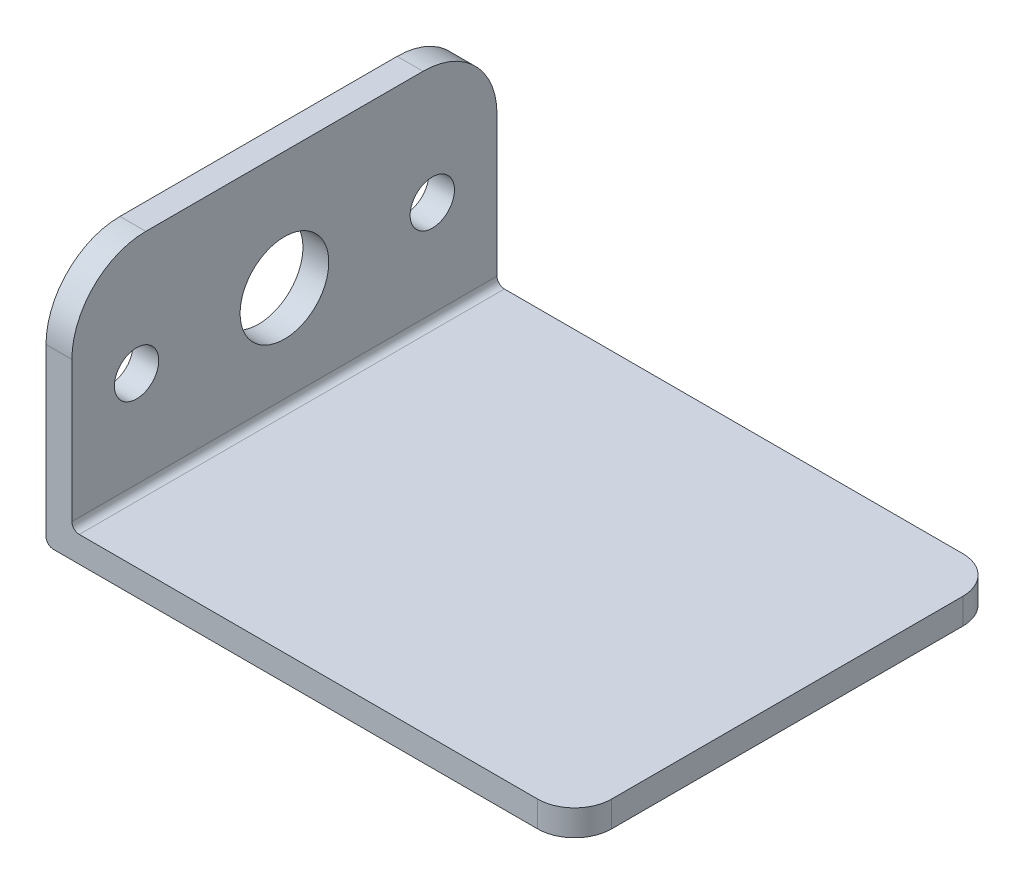
ISO-10303-21;
HEADER;
FILE_DESCRIPTION(('STEP AP214'),'2;1');
FILE_NAME('part.step','',(''),(''),'','','');
FILE_SCHEMA(('AUTOMOTIVE_DESIGN { 1 0 10303 214 1 1 1 1 }'));
ENDSEC;
DATA;
#1=APPLICATION_CONTEXT('core data for automotive mechanical design processes');
#2=APPLICATION_PROTOCOL_DEFINITION('international standard','automotive_design',2000,#1);
#3=PRODUCT_CONTEXT('',#1,'mechanical');
#4=PRODUCT('Part','Part','',(#3));
#5=PRODUCT_RELATED_PRODUCT_CATEGORY('part','',(#4));
#6=PRODUCT_DEFINITION_FORMATION('','',#4);
#7=PRODUCT_DEFINITION_CONTEXT('part definition',#1,'design');
#8=PRODUCT_DEFINITION('design','',#6,#7);
#9=PRODUCT_DEFINITION_SHAPE('','',#8);
#10=(LENGTH_UNIT() NAMED_UNIT(*) SI_UNIT(.MILLI.,.METRE.));
#11=(NAMED_UNIT(*) PLANE_ANGLE_UNIT() SI_UNIT($,.RADIAN.));
#12=(NAMED_UNIT(*) SI_UNIT($,.STERADIAN.) SOLID_ANGLE_UNIT());
#13=UNCERTAINTY_MEASURE_WITH_UNIT(LENGTH_MEASURE(1.E-05),#10,'distance_accuracy_value','');
#14=(GEOMETRIC_REPRESENTATION_CONTEXT(3) GLOBAL_UNCERTAINTY_ASSIGNED_CONTEXT((#13)) GLOBAL_UNIT_ASSIGNED_CONTEXT((#10,
#11,#12)) REPRESENTATION_CONTEXT('',''));
#15=CARTESIAN_POINT('',(0.,0.,0.));
#16=DIRECTION('',(0.,0.,1.));
#17=DIRECTION('',(1.,0.,0.));
#18=AXIS2_PLACEMENT_3D('',#15,#16,#17);
#19=CARTESIAN_POINT('',(3.50000000000001,3.5,28.75));
#20=DIRECTION('',(-1.,0.,0.));
#21=DIRECTION('',(0.,-1.,0.));
#22=AXIS2_PLACEMENT_3D('',#19,#20,#21);
#23=PLANE('',#22);
#24=DIRECTION('',(0.,1.,0.));
#25=VECTOR('',#24,1.);
#26=CARTESIAN_POINT('',(3.50000000000001,3.5,28.75));
#27=LINE('',#26,#25);
#28=CARTESIAN_POINT('',(3.5,4.5,28.75));
#29=VERTEX_POINT('',#28);
#30=CARTESIAN_POINT('',(3.5,23.5,28.75));
#31=VERTEX_POINT('',#30);
#32=EDGE_CURVE('E219',#29,#31,#27,.T.);
#33=ORIENTED_EDGE('',*,*,#32,.F.);
#34=DIRECTION('',(0.,0.,-1.));
#35=VECTOR('',#34,1.);
#36=CARTESIAN_POINT('',(3.5,4.5,-28.75));
#37=LINE('',#36,#35);
#38=CARTESIAN_POINT('',(3.5,4.5,-28.75));
#39=VERTEX_POINT('',#38);
#40=EDGE_CURVE('E201',#29,#39,#37,.T.);
#41=ORIENTED_EDGE('',*,*,#40,.T.);
#42=DIRECTION('',(0.,1.,0.));
#43=VECTOR('',#42,1.);
#44=CARTESIAN_POINT('',(3.50000000000001,3.5,-28.75));
#45=LINE('',#44,#43);
#46=CARTESIAN_POINT('',(3.5,23.5,-28.75));
#47=VERTEX_POINT('',#46);
#48=EDGE_CURVE('E212',#39,#47,#45,.T.);
#49=ORIENTED_EDGE('',*,*,#48,.T.);
#50=CARTESIAN_POINT('',(3.5,23.5,-18.75));
#51=DIRECTION('',(-1.,0.,0.));
#52=DIRECTION('',(0.,-1.,0.));
#53=AXIS2_PLACEMENT_3D('',#50,#51,#52);
#54=CIRCLE('',#53,10.);
#55=CARTESIAN_POINT('',(3.5,33.5,-18.75));
#56=VERTEX_POINT('',#55);
#57=EDGE_CURVE('E187',#47,#56,#54,.F.);
#58=ORIENTED_EDGE('',*,*,#57,.T.);
#59=DIRECTION('',(0.,0.,-1.));
#60=VECTOR('',#59,1.);
#61=CARTESIAN_POINT('',(3.5,33.5,28.75));
#62=LINE('',#61,#60);
#63=CARTESIAN_POINT('',(3.5,33.5,18.75));
#64=VERTEX_POINT('',#63);
#65=EDGE_CURVE('E153',#64,#56,#62,.T.);
#66=ORIENTED_EDGE('',*,*,#65,.F.);
#67=CARTESIAN_POINT('',(3.5,23.5,18.75));
#68=DIRECTION('',(-1.,0.,0.));
#69=DIRECTION('',(0.,-1.,0.));
#70=AXIS2_PLACEMENT_3D('',#67,#68,#69);
#71=CIRCLE('',#70,10.);
#72=EDGE_CURVE('E184',#64,#31,#71,.F.);
#73=ORIENTED_EDGE('',*,*,#72,.T.);
#74=EDGE_LOOP('',(#33,#41,#49,#58,#66,#73));
#75=FACE_BOUND('',#74,.T.);
#76=CARTESIAN_POINT('',(3.5,17.5,-20.));
#77=DIRECTION('',(1.,0.,0.));
#78=DIRECTION('',(0.,1.,0.));
#79=AXIS2_PLACEMENT_3D('',#76,#77,#78);
#80=CIRCLE('',#79,3.);
#81=CARTESIAN_POINT('',(3.5,20.5,-20.));
#82=VERTEX_POINT('',#81);
#83=EDGE_CURVE('E266',#82,#82,#80,.T.);
#84=ORIENTED_EDGE('',*,*,#83,.F.);
#85=EDGE_LOOP('',(#84));
#86=FACE_BOUND('',#85,.T.);
#87=CARTESIAN_POINT('',(3.5,17.5,20.));
#88=DIRECTION('',(1.,0.,0.));
#89=DIRECTION('',(0.,1.,0.));
#90=AXIS2_PLACEMENT_3D('',#87,#88,#89);
#91=CIRCLE('',#90,3.);
#92=CARTESIAN_POINT('',(3.5,20.5,20.));
#93=VERTEX_POINT('',#92);
#94=EDGE_CURVE('E267',#93,#93,#91,.T.);
#95=ORIENTED_EDGE('',*,*,#94,.F.);
#96=EDGE_LOOP('',(#95));
#97=FACE_BOUND('',#96,.T.);
#98=CARTESIAN_POINT('',(3.5,17.5000000079424,8.25322719498123E-11));
#99=DIRECTION('',(-1.,0.,0.));
#100=DIRECTION('',(0.,-1.,0.));
#101=AXIS2_PLACEMENT_3D('',#98,#99,#100);
#102=CIRCLE('',#101,5.99999999229521);
#103=CARTESIAN_POINT('',(3.5,17.5000000079424,5.99999999237774));
#104=VERTEX_POINT('',#103);
#105=EDGE_CURVE('E270',#104,#104,#102,.F.);
#106=ORIENTED_EDGE('',*,*,#105,.F.);
#107=EDGE_LOOP('',(#106));
#108=FACE_BOUND('',#107,.T.);
#109=ADVANCED_FACE('F45',(#75,#86,#97,#108),#23,.F.);
#110=CARTESIAN_POINT('',(0.,33.5,28.75));
#111=DIRECTION('',(1.,0.,0.));
#112=DIRECTION('',(0.,1.,0.));
#113=AXIS2_PLACEMENT_3D('',#110,#111,#112);
#114=PLANE('',#113);
#115=DIRECTION('',(0.,-1.,0.));
#116=VECTOR('',#115,1.);
#117=CARTESIAN_POINT('',(0.,33.5,-28.75));
#118=LINE('',#117,#116);
#119=CARTESIAN_POINT('',(0.,23.5,-28.75));
#120=VERTEX_POINT('',#119);
#121=CARTESIAN_POINT('',(0.,1.,-28.75));
#122=VERTEX_POINT('',#121);
#123=EDGE_CURVE('E235',#120,#122,#118,.T.);
#124=ORIENTED_EDGE('',*,*,#123,.T.);
#125=DIRECTION('',(0.,0.,-1.));
#126=VECTOR('',#125,1.);
#127=CARTESIAN_POINT('',(0.,1.,28.75));
#128=LINE('',#127,#126);
#129=CARTESIAN_POINT('',(0.,1.,28.75));
#130=VERTEX_POINT('',#129);
#131=EDGE_CURVE('E197',#122,#130,#128,.F.);
#132=ORIENTED_EDGE('',*,*,#131,.T.);
#133=DIRECTION('',(0.,-1.,0.));
#134=VECTOR('',#133,1.);
#135=CARTESIAN_POINT('',(0.,33.5,28.75));
#136=LINE('',#135,#134);
#137=CARTESIAN_POINT('',(0.,23.5,28.75));
#138=VERTEX_POINT('',#137);
#139=EDGE_CURVE('E223',#138,#130,#136,.T.);
#140=ORIENTED_EDGE('',*,*,#139,.F.);
#141=CARTESIAN_POINT('',(0.,23.5,18.75));
#142=DIRECTION('',(1.,0.,0.));
#143=DIRECTION('',(0.,1.,0.));
#144=AXIS2_PLACEMENT_3D('',#141,#142,#143);
#145=CIRCLE('',#144,10.);
#146=CARTESIAN_POINT('',(0.,33.5,18.75));
#147=VERTEX_POINT('',#146);
#148=EDGE_CURVE('E177',#138,#147,#145,.F.);
#149=ORIENTED_EDGE('',*,*,#148,.T.);
#150=DIRECTION('',(0.,0.,-1.));
#151=VECTOR('',#150,1.);
#152=CARTESIAN_POINT('',(0.,33.5,28.75));
#153=LINE('',#152,#151);
#154=CARTESIAN_POINT('',(0.,33.5,-18.75));
#155=VERTEX_POINT('',#154);
#156=EDGE_CURVE('E226',#147,#155,#153,.T.);
#157=ORIENTED_EDGE('',*,*,#156,.T.);
#158=CARTESIAN_POINT('',(0.,23.5,-18.75));
#159=DIRECTION('',(1.,0.,0.));
#160=DIRECTION('',(0.,1.,0.));
#161=AXIS2_PLACEMENT_3D('',#158,#159,#160);
#162=CIRCLE('',#161,10.);
#163=EDGE_CURVE('E179',#155,#120,#162,.F.);
#164=ORIENTED_EDGE('',*,*,#163,.T.);
#165=EDGE_LOOP('',(#124,#132,#140,#149,#157,#164));
#166=FACE_BOUND('',#165,.T.);
#167=CARTESIAN_POINT('',(0.,17.5,-20.));
#168=DIRECTION('',(1.,0.,0.));
#169=DIRECTION('',(0.,1.,0.));
#170=AXIS2_PLACEMENT_3D('',#167,#168,#169);
#171=CIRCLE('',#170,3.);
#172=CARTESIAN_POINT('',(0.,20.5,-20.));
#173=VERTEX_POINT('',#172);
#174=EDGE_CURVE('E232',#173,#173,#171,.F.);
#175=ORIENTED_EDGE('',*,*,#174,.F.);
#176=EDGE_LOOP('',(#175));
#177=FACE_BOUND('',#176,.T.);
#178=CARTESIAN_POINT('',(0.,17.5,20.));
#179=DIRECTION('',(1.,0.,0.));
#180=DIRECTION('',(0.,1.,0.));
#181=AXIS2_PLACEMENT_3D('',#178,#179,#180);
#182=CIRCLE('',#181,3.);
#183=CARTESIAN_POINT('',(0.,20.5,20.));
#184=VERTEX_POINT('',#183);
#185=EDGE_CURVE('E263',#184,#184,#182,.F.);
#186=ORIENTED_EDGE('',*,*,#185,.F.);
#187=EDGE_LOOP('',(#186));
#188=FACE_BOUND('',#187,.T.);
#189=CARTESIAN_POINT('',(0.,17.5000000079424,8.24956113957545E-11));
#190=DIRECTION('',(1.,0.,0.));
#191=DIRECTION('',(0.,1.,0.));
#192=AXIS2_PLACEMENT_3D('',#189,#190,#191);
#193=CIRCLE('',#192,5.99999999229521);
#194=CARTESIAN_POINT('',(0.,17.5000000079424,5.9999999923777));
#195=VERTEX_POINT('',#194);
#196=EDGE_CURVE('E49',#195,#195,#193,.F.);
#197=ORIENTED_EDGE('',*,*,#196,.F.);
#198=EDGE_LOOP('',(#197));
#199=FACE_BOUND('',#198,.T.);
#200=ADVANCED_FACE('F252',(#166,#177,#188,#199),#114,.F.);
#201=CARTESIAN_POINT('',(0.,0.,28.75));
#202=DIRECTION('',(0.,1.,0.));
#203=DIRECTION('',(-1.,0.,0.));
#204=AXIS2_PLACEMENT_3D('',#201,#202,#203);
#205=PLANE('',#204);
#206=DIRECTION('',(1.,0.,0.));
#207=VECTOR('',#206,1.);
#208=CARTESIAN_POINT('',(0.,0.,28.75));
#209=LINE('',#208,#207);
#210=CARTESIAN_POINT('',(1.,0.,28.75));
#211=VERTEX_POINT('',#210);
#212=CARTESIAN_POINT('',(66.5,0.,28.75));
#213=VERTEX_POINT('',#212);
#214=EDGE_CURVE('E228',#211,#213,#209,.T.);
#215=ORIENTED_EDGE('',*,*,#214,.F.);
#216=DIRECTION('',(0.,0.,-1.));
#217=VECTOR('',#216,1.);
#218=CARTESIAN_POINT('',(1.,0.,28.75));
#219=LINE('',#218,#217);
#220=CARTESIAN_POINT('',(1.,0.,-28.75));
#221=VERTEX_POINT('',#220);
#222=EDGE_CURVE('E192',#211,#221,#219,.T.);
#223=ORIENTED_EDGE('',*,*,#222,.T.);
#224=DIRECTION('',(1.,0.,0.));
#225=VECTOR('',#224,1.);
#226=CARTESIAN_POINT('',(0.,0.,-28.75));
#227=LINE('',#226,#225);
#228=CARTESIAN_POINT('',(66.5,0.,-28.75));
#229=VERTEX_POINT('',#228);
#230=EDGE_CURVE('E215',#221,#229,#227,.T.);
#231=ORIENTED_EDGE('',*,*,#230,.T.);
#232=CARTESIAN_POINT('',(66.5,0.,-23.75));
#233=DIRECTION('',(0.,1.,0.));
#234=DIRECTION('',(-1.,0.,0.));
#235=AXIS2_PLACEMENT_3D('',#232,#233,#234);
#236=CIRCLE('',#235,5.);
#237=CARTESIAN_POINT('',(71.5,0.,-23.75));
#238=VERTEX_POINT('',#237);
#239=EDGE_CURVE('E168',#229,#238,#236,.F.);
#240=ORIENTED_EDGE('',*,*,#239,.T.);
#241=DIRECTION('',(0.,0.,-1.));
#242=VECTOR('',#241,1.);
#243=CARTESIAN_POINT('',(71.5,0.,28.75));
#244=LINE('',#243,#242);
#245=CARTESIAN_POINT('',(71.5,0.,23.75));
#246=VERTEX_POINT('',#245);
#247=EDGE_CURVE('E152',#246,#238,#244,.T.);
#248=ORIENTED_EDGE('',*,*,#247,.F.);
#249=CARTESIAN_POINT('',(66.5,0.,23.75));
#250=DIRECTION('',(0.,1.,0.));
#251=DIRECTION('',(-1.,0.,0.));
#252=AXIS2_PLACEMENT_3D('',#249,#250,#251);
#253=CIRCLE('',#252,5.);
#254=EDGE_CURVE('E158',#246,#213,#253,.F.);
#255=ORIENTED_EDGE('',*,*,#254,.T.);
#256=EDGE_LOOP('',(#215,#223,#231,#240,#248,#255));
#257=FACE_BOUND('',#256,.T.);
#258=ADVANCED_FACE('F261',(#257),#205,.F.);
#259=CARTESIAN_POINT('',(71.5,0.,28.75));
#260=DIRECTION('',(-1.,0.,0.));
#261=DIRECTION('',(0.,0.,1.));
#262=AXIS2_PLACEMENT_3D('',#259,#260,#261);
#263=PLANE('',#262);
#264=ORIENTED_EDGE('',*,*,#247,.T.);
#265=DIRECTION('',(0.,1.,0.));
#266=VECTOR('',#265,1.);
#267=CARTESIAN_POINT('',(71.5,0.,-23.75));
#268=LINE('',#267,#266);
#269=CARTESIAN_POINT('',(71.5,3.50000000000004,-23.75));
#270=VERTEX_POINT('',#269);
#271=EDGE_CURVE('E143',#238,#270,#268,.T.);
#272=ORIENTED_EDGE('',*,*,#271,.T.);
#273=DIRECTION('',(0.,0.,-1.));
#274=VECTOR('',#273,1.);
#275=CARTESIAN_POINT('',(71.5,3.50000000000004,28.75));
#276=LINE('',#275,#274);
#277=CARTESIAN_POINT('',(71.5,3.50000000000004,23.75));
#278=VERTEX_POINT('',#277);
#279=EDGE_CURVE('E136',#278,#270,#276,.T.);
#280=ORIENTED_EDGE('',*,*,#279,.F.);
#281=DIRECTION('',(0.,1.,0.));
#282=VECTOR('',#281,1.);
#283=CARTESIAN_POINT('',(71.5,0.,23.75));
#284=LINE('',#283,#282);
#285=EDGE_CURVE('E149',#278,#246,#284,.F.);
#286=ORIENTED_EDGE('',*,*,#285,.T.);
#287=EDGE_LOOP('',(#264,#272,#280,#286));
#288=FACE_BOUND('',#287,.T.);
#289=ADVANCED_FACE('F148',(#288),#263,.F.);
#290=CARTESIAN_POINT('',(3.50000000000001,3.5,28.75));
#291=DIRECTION('',(0.,-1.,0.));
#292=DIRECTION('',(1.,0.,0.));
#293=AXIS2_PLACEMENT_3D('',#290,#291,#292);
#294=PLANE('',#293);
#295=DIRECTION('',(-1.,0.,0.));
#296=VECTOR('',#295,1.);
#297=CARTESIAN_POINT('',(3.50000000000001,3.5,-28.75));
#298=LINE('',#297,#296);
#299=CARTESIAN_POINT('',(66.5,3.50000000000003,-28.75));
#300=VERTEX_POINT('',#299);
#301=CARTESIAN_POINT('',(4.50000000000001,3.5,-28.75));
#302=VERTEX_POINT('',#301);
#303=EDGE_CURVE('E210',#300,#302,#298,.T.);
#304=ORIENTED_EDGE('',*,*,#303,.T.);
#305=DIRECTION('',(0.,0.,-1.));
#306=VECTOR('',#305,1.);
#307=CARTESIAN_POINT('',(4.50000000000001,3.5,28.75));
#308=LINE('',#307,#306);
#309=CARTESIAN_POINT('',(4.50000000000001,3.5,28.75));
#310=VERTEX_POINT('',#309);
#311=EDGE_CURVE('E61',#302,#310,#308,.F.);
#312=ORIENTED_EDGE('',*,*,#311,.T.);
#313=DIRECTION('',(-1.,0.,0.));
#314=VECTOR('',#313,1.);
#315=CARTESIAN_POINT('',(3.50000000000001,3.5,28.75));
#316=LINE('',#315,#314);
#317=CARTESIAN_POINT('',(66.5,3.50000000000003,28.75));
#318=VERTEX_POINT('',#317);
#319=EDGE_CURVE('E137',#318,#310,#316,.T.);
#320=ORIENTED_EDGE('',*,*,#319,.F.);
#321=CARTESIAN_POINT('',(66.5,3.50000000000003,23.75));
#322=DIRECTION('',(0.,-1.,0.));
#323=DIRECTION('',(1.,0.,0.));
#324=AXIS2_PLACEMENT_3D('',#321,#322,#323);
#325=CIRCLE('',#324,5.);
#326=EDGE_CURVE('E133',#318,#278,#325,.F.);
#327=ORIENTED_EDGE('',*,*,#326,.T.);
#328=ORIENTED_EDGE('',*,*,#279,.T.);
#329=CARTESIAN_POINT('',(66.5,3.50000000000003,-23.75));
#330=DIRECTION('',(0.,-1.,0.));
#331=DIRECTION('',(1.,0.,0.));
#332=AXIS2_PLACEMENT_3D('',#329,#330,#331);
#333=CIRCLE('',#332,5.);
#334=EDGE_CURVE('E142',#270,#300,#333,.F.);
#335=ORIENTED_EDGE('',*,*,#334,.T.);
#336=EDGE_LOOP('',(#304,#312,#320,#327,#328,#335));
#337=FACE_BOUND('',#336,.T.);
#338=ADVANCED_FACE('F135',(#337),#294,.F.);
#339=CARTESIAN_POINT('',(0.,33.5,28.75));
#340=DIRECTION('',(0.,-1.,0.));
#341=DIRECTION('',(0.,0.,-1.));
#342=AXIS2_PLACEMENT_3D('',#339,#340,#341);
#343=PLANE('',#342);
#344=ORIENTED_EDGE('',*,*,#65,.T.);
#345=DIRECTION('',(-1.,0.,0.));
#346=VECTOR('',#345,1.);
#347=CARTESIAN_POINT('',(0.,33.5,-18.75));
#348=LINE('',#347,#346);
#349=EDGE_CURVE('E174',#56,#155,#348,.T.);
#350=ORIENTED_EDGE('',*,*,#349,.T.);
#351=ORIENTED_EDGE('',*,*,#156,.F.);
#352=DIRECTION('',(-1.,0.,0.));
#353=VECTOR('',#352,1.);
#354=CARTESIAN_POINT('',(3.5,33.5,18.75));
#355=LINE('',#354,#353);
#356=EDGE_CURVE('E172',#147,#64,#355,.F.);
#357=ORIENTED_EDGE('',*,*,#356,.T.);
#358=EDGE_LOOP('',(#344,#350,#351,#357));
#359=FACE_BOUND('',#358,.T.);
#360=ADVANCED_FACE('F243',(#359),#343,.F.);
#361=CARTESIAN_POINT('',(0.,0.,28.75));
#362=DIRECTION('',(0.,0.,1.));
#363=DIRECTION('',(1.,0.,0.));
#364=AXIS2_PLACEMENT_3D('',#361,#362,#363);
#365=PLANE('',#364);
#366=ORIENTED_EDGE('',*,*,#139,.T.);
#367=CARTESIAN_POINT('',(1.,1.,28.75));
#368=DIRECTION('',(0.,0.,1.));
#369=DIRECTION('',(1.,0.,0.));
#370=AXIS2_PLACEMENT_3D('',#367,#368,#369);
#371=CIRCLE('',#370,1.);
#372=EDGE_CURVE('E199',#130,#211,#371,.T.);
#373=ORIENTED_EDGE('',*,*,#372,.T.);
#374=ORIENTED_EDGE('',*,*,#214,.T.);
#375=DIRECTION('',(0.,1.,0.));
#376=VECTOR('',#375,1.);
#377=CARTESIAN_POINT('',(66.5,3.50000000000004,28.75));
#378=LINE('',#377,#376);
#379=EDGE_CURVE('E170',#213,#318,#378,.T.);
#380=ORIENTED_EDGE('',*,*,#379,.T.);
#381=ORIENTED_EDGE('',*,*,#319,.T.);
#382=CARTESIAN_POINT('',(4.50000000000001,4.5,28.75));
#383=DIRECTION('',(0.,0.,1.));
#384=DIRECTION('',(1.,0.,0.));
#385=AXIS2_PLACEMENT_3D('',#382,#383,#384);
#386=CIRCLE('',#385,1.);
#387=EDGE_CURVE('E11',#310,#29,#386,.F.);
#388=ORIENTED_EDGE('',*,*,#387,.T.);
#389=ORIENTED_EDGE('',*,*,#32,.T.);
#390=DIRECTION('',(-1.,0.,0.));
#391=VECTOR('',#390,1.);
#392=CARTESIAN_POINT('',(0.,23.5,28.75));
#393=LINE('',#392,#391);
#394=EDGE_CURVE('E189',#31,#138,#393,.T.);
#395=ORIENTED_EDGE('',*,*,#394,.T.);
#396=EDGE_LOOP('',(#366,#373,#374,#380,#381,#388,#389,#395));
#397=FACE_BOUND('',#396,.T.);
#398=ADVANCED_FACE('F296',(#397),#365,.T.);
#399=CARTESIAN_POINT('',(0.,0.,-28.75));
#400=DIRECTION('',(0.,0.,1.));
#401=DIRECTION('',(1.,0.,0.));
#402=AXIS2_PLACEMENT_3D('',#399,#400,#401);
#403=PLANE('',#402);
#404=ORIENTED_EDGE('',*,*,#230,.F.);
#405=CARTESIAN_POINT('',(1.,1.,-28.75));
#406=DIRECTION('',(0.,0.,1.));
#407=DIRECTION('',(1.,0.,0.));
#408=AXIS2_PLACEMENT_3D('',#405,#406,#407);
#409=CIRCLE('',#408,1.);
#410=EDGE_CURVE('E195',#221,#122,#409,.F.);
#411=ORIENTED_EDGE('',*,*,#410,.T.);
#412=ORIENTED_EDGE('',*,*,#123,.F.);
#413=DIRECTION('',(-1.,0.,0.));
#414=VECTOR('',#413,1.);
#415=CARTESIAN_POINT('',(0.,23.5,-28.75));
#416=LINE('',#415,#414);
#417=EDGE_CURVE('E181',#120,#47,#416,.F.);
#418=ORIENTED_EDGE('',*,*,#417,.T.);
#419=ORIENTED_EDGE('',*,*,#48,.F.);
#420=CARTESIAN_POINT('',(4.50000000000001,4.5,-28.75));
#421=DIRECTION('',(0.,0.,1.));
#422=DIRECTION('',(1.,0.,0.));
#423=AXIS2_PLACEMENT_3D('',#420,#421,#422);
#424=CIRCLE('',#423,1.);
#425=EDGE_CURVE('E54',#39,#302,#424,.T.);
#426=ORIENTED_EDGE('',*,*,#425,.T.);
#427=ORIENTED_EDGE('',*,*,#303,.F.);
#428=DIRECTION('',(0.,1.,0.));
#429=VECTOR('',#428,1.);
#430=CARTESIAN_POINT('',(66.5,0.,-28.75));
#431=LINE('',#430,#429);
#432=EDGE_CURVE('E164',#300,#229,#431,.F.);
#433=ORIENTED_EDGE('',*,*,#432,.T.);
#434=EDGE_LOOP('',(#404,#411,#412,#418,#419,#426,#427,#433));
#435=FACE_BOUND('',#434,.T.);
#436=ADVANCED_FACE('F209',(#435),#403,.F.);
#437=CARTESIAN_POINT('',(66.5,0.,-23.75));
#438=DIRECTION('',(0.,1.,0.));
#439=DIRECTION('',(0.,0.,1.));
#440=AXIS2_PLACEMENT_3D('',#437,#438,#439);
#441=CYLINDRICAL_SURFACE('',#440,5.);
#442=ORIENTED_EDGE('',*,*,#239,.F.);
#443=ORIENTED_EDGE('',*,*,#432,.F.);
#444=ORIENTED_EDGE('',*,*,#334,.F.);
#445=ORIENTED_EDGE('',*,*,#271,.F.);
#446=EDGE_LOOP('',(#442,#443,#444,#445));
#447=FACE_BOUND('',#446,.T.);
#448=ADVANCED_FACE('F302',(#447),#441,.T.);
#449=CARTESIAN_POINT('',(66.5,0.,23.75));
#450=DIRECTION('',(0.,-1.,0.));
#451=DIRECTION('',(0.,0.,-1.));
#452=AXIS2_PLACEMENT_3D('',#449,#450,#451);
#453=CYLINDRICAL_SURFACE('',#452,5.);
#454=ORIENTED_EDGE('',*,*,#254,.F.);
#455=ORIENTED_EDGE('',*,*,#285,.F.);
#456=ORIENTED_EDGE('',*,*,#326,.F.);
#457=ORIENTED_EDGE('',*,*,#379,.F.);
#458=EDGE_LOOP('',(#454,#455,#456,#457));
#459=FACE_BOUND('',#458,.T.);
#460=ADVANCED_FACE('F156',(#459),#453,.T.);
#461=CARTESIAN_POINT('',(0.,23.5,-18.75));
#462=DIRECTION('',(-1.,0.,0.));
#463=DIRECTION('',(0.,0.,1.));
#464=AXIS2_PLACEMENT_3D('',#461,#462,#463);
#465=CYLINDRICAL_SURFACE('',#464,10.);
#466=ORIENTED_EDGE('',*,*,#57,.F.);
#467=ORIENTED_EDGE('',*,*,#417,.F.);
#468=ORIENTED_EDGE('',*,*,#163,.F.);
#469=ORIENTED_EDGE('',*,*,#349,.F.);
#470=EDGE_LOOP('',(#466,#467,#468,#469));
#471=FACE_BOUND('',#470,.T.);
#472=ADVANCED_FACE('F248',(#471),#465,.T.);
#473=CARTESIAN_POINT('',(0.,23.5,18.75));
#474=DIRECTION('',(1.,0.,0.));
#475=DIRECTION('',(0.,0.,-1.));
#476=AXIS2_PLACEMENT_3D('',#473,#474,#475);
#477=CYLINDRICAL_SURFACE('',#476,10.);
#478=ORIENTED_EDGE('',*,*,#72,.F.);
#479=ORIENTED_EDGE('',*,*,#356,.F.);
#480=ORIENTED_EDGE('',*,*,#148,.F.);
#481=ORIENTED_EDGE('',*,*,#394,.F.);
#482=EDGE_LOOP('',(#478,#479,#480,#481));
#483=FACE_BOUND('',#482,.T.);
#484=ADVANCED_FACE('F310',(#483),#477,.T.);
#485=CARTESIAN_POINT('',(1.,1.,28.75));
#486=DIRECTION('',(0.,0.,-1.));
#487=DIRECTION('',(-1.,0.,0.));
#488=AXIS2_PLACEMENT_3D('',#485,#486,#487);
#489=CYLINDRICAL_SURFACE('',#488,1.);
#490=ORIENTED_EDGE('',*,*,#372,.F.);
#491=ORIENTED_EDGE('',*,*,#131,.F.);
#492=ORIENTED_EDGE('',*,*,#410,.F.);
#493=ORIENTED_EDGE('',*,*,#222,.F.);
#494=EDGE_LOOP('',(#490,#491,#492,#493));
#495=FACE_BOUND('',#494,.T.);
#496=ADVANCED_FACE('F258',(#495),#489,.T.);
#497=CARTESIAN_POINT('',(4.50000000000001,4.5,28.75));
#498=DIRECTION('',(0.,0.,1.));
#499=DIRECTION('',(1.,0.,0.));
#500=AXIS2_PLACEMENT_3D('',#497,#498,#499);
#501=CYLINDRICAL_SURFACE('',#500,1.);
#502=ORIENTED_EDGE('',*,*,#387,.F.);
#503=ORIENTED_EDGE('',*,*,#311,.F.);
#504=ORIENTED_EDGE('',*,*,#425,.F.);
#505=ORIENTED_EDGE('',*,*,#40,.F.);
#506=EDGE_LOOP('',(#502,#503,#504,#505));
#507=FACE_BOUND('',#506,.T.);
#508=ADVANCED_FACE('F47',(#507),#501,.F.);
#509=CARTESIAN_POINT('',(-0.00100000000000967,17.5,-20.));
#510=DIRECTION('',(1.,0.,0.));
#511=DIRECTION('',(0.,1.,0.));
#512=AXIS2_PLACEMENT_3D('',#509,#510,#511);
#513=CYLINDRICAL_SURFACE('',#512,3.);
#514=ORIENTED_EDGE('',*,*,#83,.T.);
#515=EDGE_LOOP('',(#514));
#516=FACE_BOUND('',#515,.T.);
#517=ORIENTED_EDGE('',*,*,#174,.T.);
#518=EDGE_LOOP('',(#517));
#519=FACE_BOUND('',#518,.T.);
#520=ADVANCED_FACE('F318',(#516,#519),#513,.F.);
#521=CARTESIAN_POINT('',(-0.00100000000000967,17.5,20.));
#522=DIRECTION('',(1.,0.,0.));
#523=DIRECTION('',(0.,1.,0.));
#524=AXIS2_PLACEMENT_3D('',#521,#522,#523);
#525=CYLINDRICAL_SURFACE('',#524,3.);
#526=ORIENTED_EDGE('',*,*,#94,.T.);
#527=EDGE_LOOP('',(#526));
#528=FACE_BOUND('',#527,.T.);
#529=ORIENTED_EDGE('',*,*,#185,.T.);
#530=EDGE_LOOP('',(#529));
#531=FACE_BOUND('',#530,.T.);
#532=ADVANCED_FACE('F322',(#528,#531),#525,.F.);
#533=CARTESIAN_POINT('',(-3.08780778723872E-13,17.5000000079424,8.24956113957545E-11));
#534=DIRECTION('',(-1.,0.,0.));
#535=DIRECTION('',(0.,0.,1.));
#536=AXIS2_PLACEMENT_3D('',#533,#534,#535);
#537=CYLINDRICAL_SURFACE('',#536,5.99999999229521);
#538=CARTESIAN_POINT('',(0.,17.5000000079424,5.9999999923777));
#539=CARTESIAN_POINT('',(0.0364583333333304,17.5000000079424,5.9999999923777));
#540=CARTESIAN_POINT('',(0.0729166666666637,17.5000000079424,5.9999999923777));
#541=CARTESIAN_POINT('',(0.14583333333333,17.5000000079424,5.99999999237771));
#542=CARTESIAN_POINT('',(0.182291666666664,17.5000000079424,5.99999999237771));
#543=CARTESIAN_POINT('',(0.255208333333331,17.5000000079424,5.99999999237771));
#544=CARTESIAN_POINT('',(0.291666666666664,17.5000000079424,5.99999999237771));
#545=CARTESIAN_POINT('',(0.364583333333331,17.5000000079424,5.99999999237771));
#546=CARTESIAN_POINT('',(0.401041666666664,17.5000000079424,5.99999999237771));
#547=CARTESIAN_POINT('',(0.473958333333331,17.5000000079424,5.99999999237771));
#548=CARTESIAN_POINT('',(0.510416666666664,17.5000000079424,5.99999999237771));
#549=CARTESIAN_POINT('',(0.583333333333331,17.5000000079424,5.99999999237771));
#550=CARTESIAN_POINT('',(0.619791666666664,17.5000000079424,5.99999999237771));
#551=CARTESIAN_POINT('',(0.692708333333331,17.5000000079424,5.99999999237771));
#552=CARTESIAN_POINT('',(0.729166666666665,17.5000000079424,5.99999999237771));
#553=CARTESIAN_POINT('',(0.802083333333331,17.5000000079424,5.99999999237771));
#554=CARTESIAN_POINT('',(0.838541666666665,17.5000000079424,5.99999999237771));
#555=CARTESIAN_POINT('',(0.911458333333331,17.5000000079424,5.99999999237771));
#556=CARTESIAN_POINT('',(0.947916666666665,17.5000000079424,5.99999999237771));
#557=CARTESIAN_POINT('',(1.02083333333333,17.5000000079424,5.99999999237771));
#558=CARTESIAN_POINT('',(1.05729166666667,17.5000000079424,5.99999999237771));
#559=CARTESIAN_POINT('',(1.13020833333333,17.5000000079424,5.99999999237771));
#560=CARTESIAN_POINT('',(1.16666666666667,17.5000000079424,5.99999999237771));
#561=CARTESIAN_POINT('',(1.23958333333333,17.5000000079424,5.99999999237772));
#562=CARTESIAN_POINT('',(1.27604166666667,17.5000000079424,5.99999999237772));
#563=CARTESIAN_POINT('',(1.34895833333333,17.5000000079424,5.99999999237772));
#564=CARTESIAN_POINT('',(1.38541666666667,17.5000000079424,5.99999999237772));
#565=CARTESIAN_POINT('',(1.45833333333333,17.5000000079424,5.99999999237772));
#566=CARTESIAN_POINT('',(1.49479166666667,17.5000000079424,5.99999999237772));
#567=CARTESIAN_POINT('',(1.56770833333333,17.5000000079424,5.99999999237772));
#568=CARTESIAN_POINT('',(1.60416666666667,17.5000000079424,5.99999999237772));
#569=CARTESIAN_POINT('',(1.67708333333333,17.5000000079424,5.99999999237772));
#570=CARTESIAN_POINT('',(1.71354166666667,17.5000000079424,5.99999999237772));
#571=CARTESIAN_POINT('',(1.78645833333333,17.5000000079424,5.99999999237772));
#572=CARTESIAN_POINT('',(1.82291666666667,17.5000000079424,5.99999999237772));
#573=CARTESIAN_POINT('',(1.89583333333333,17.5000000079424,5.99999999237772));
#574=CARTESIAN_POINT('',(1.93229166666667,17.5000000079424,5.99999999237772));
#575=CARTESIAN_POINT('',(2.00520833333333,17.5000000079424,5.99999999237772));
#576=CARTESIAN_POINT('',(2.04166666666667,17.5000000079424,5.99999999237772));
#577=CARTESIAN_POINT('',(2.11458333333333,17.5000000079424,5.99999999237772));
#578=CARTESIAN_POINT('',(2.15104166666667,17.5000000079424,5.99999999237772));
#579=CARTESIAN_POINT('',(2.22395833333333,17.5000000079424,5.99999999237773));
#580=CARTESIAN_POINT('',(2.26041666666667,17.5000000079424,5.99999999237773));
#581=CARTESIAN_POINT('',(2.33333333333333,17.5000000079424,5.99999999237773));
#582=CARTESIAN_POINT('',(2.36979166666667,17.5000000079424,5.99999999237773));
#583=CARTESIAN_POINT('',(2.44270833333333,17.5000000079424,5.99999999237773));
#584=CARTESIAN_POINT('',(2.47916666666667,17.5000000079424,5.99999999237773));
#585=CARTESIAN_POINT('',(2.55208333333333,17.5000000079424,5.99999999237773));
#586=CARTESIAN_POINT('',(2.58854166666667,17.5000000079424,5.99999999237773));
#587=CARTESIAN_POINT('',(2.66145833333333,17.5000000079424,5.99999999237773));
#588=CARTESIAN_POINT('',(2.69791666666667,17.5000000079424,5.99999999237773));
#589=CARTESIAN_POINT('',(2.77083333333333,17.5000000079424,5.99999999237773));
#590=CARTESIAN_POINT('',(2.80729166666667,17.5000000079424,5.99999999237773));
#591=CARTESIAN_POINT('',(2.88020833333333,17.5000000079424,5.99999999237773));
#592=CARTESIAN_POINT('',(2.91666666666667,17.5000000079424,5.99999999237773));
#593=CARTESIAN_POINT('',(2.98958333333333,17.5000000079424,5.99999999237774));
#594=CARTESIAN_POINT('',(3.02604166666667,17.5000000079424,5.99999999237774));
#595=CARTESIAN_POINT('',(3.09895833333333,17.5000000079424,5.99999999237774));
#596=CARTESIAN_POINT('',(3.13541666666667,17.5000000079424,5.99999999237774));
#597=CARTESIAN_POINT('',(3.20833333333334,17.5000000079424,5.99999999237774));
#598=CARTESIAN_POINT('',(3.24479166666667,17.5000000079424,5.99999999237774));
#599=CARTESIAN_POINT('',(3.31770833333334,17.5000000079424,5.99999999237774));
#600=CARTESIAN_POINT('',(3.35416666666667,17.5000000079424,5.99999999237774));
#601=CARTESIAN_POINT('',(3.42708333333334,17.5000000079424,5.99999999237774));
#602=CARTESIAN_POINT('',(3.46354166666667,17.5000000079424,5.99999999237774));
#603=CARTESIAN_POINT('',(3.5,17.5000000079424,5.99999999237774));
#604=B_SPLINE_CURVE_WITH_KNOTS('',3,(#538,#539,#540,#541,#542,#543,#544,#545,#546,#547,#548,
#549,#550,#551,#552,#553,#554,#555,#556,#557,#558,#559,#560,#561,#562,#563,#564,#565,#566,#567,
#568,#569,#570,#571,#572,#573,#574,#575,#576,#577,#578,#579,#580,#581,#582,#583,#584,#585,#586,
#587,#588,#589,#590,#591,#592,#593,#594,#595,#596,#597,#598,#599,#600,#601,#602,#603),
.UNSPECIFIED.,.F.,.F.,(4,2,2,2,2,2,2,2,2,2,2,2,2,2,2,2,2,2,2,2,2,2,2,2,2,2,2,2,2,2,2,2,4),(0.,
0.109375,0.21875,0.328125,0.437500000000001,0.546875000000001,0.656250000000001,
0.765625000000001,0.875000000000001,0.984375000000001,1.09375,1.203125,1.3125,1.421875,1.53125,
1.640625,1.75,1.859375,1.96875,2.078125,2.1875,2.296875,2.40625,2.515625,2.625,2.734375,2.84375,
2.953125,3.0625,3.171875,3.28125,3.39062500000001,3.50000000000001),.UNSPECIFIED.);
#605=EDGE_CURVE('BSEAM281',#195,#104,#604,.T.);
#606=ORIENTED_EDGE('',*,*,#196,.T.);
#607=ORIENTED_EDGE('',*,*,#105,.T.);
#608=ORIENTED_EDGE('',*,*,#605,.T.);
#609=ORIENTED_EDGE('',*,*,#605,.F.);
#610=EDGE_LOOP('',(#606,#608,#607,#609));
#611=FACE_BOUND('',#610,.T.);
#612=ADVANCED_FACE('F281',(#611),#537,.F.);
#613=CLOSED_SHELL('',(#109,#200,#258,#289,#338,#360,#398,#436,#448,#460,#472,#484,#496,#508,
#520,#532,#612));
#614=MANIFOLD_SOLID_BREP('B2',#613);
#615=ADVANCED_BREP_SHAPE_REPRESENTATION('',(#18,#614),#14);
#616=SHAPE_DEFINITION_REPRESENTATION(#9,#615);
ENDSEC;
END-ISO-10303-21;
